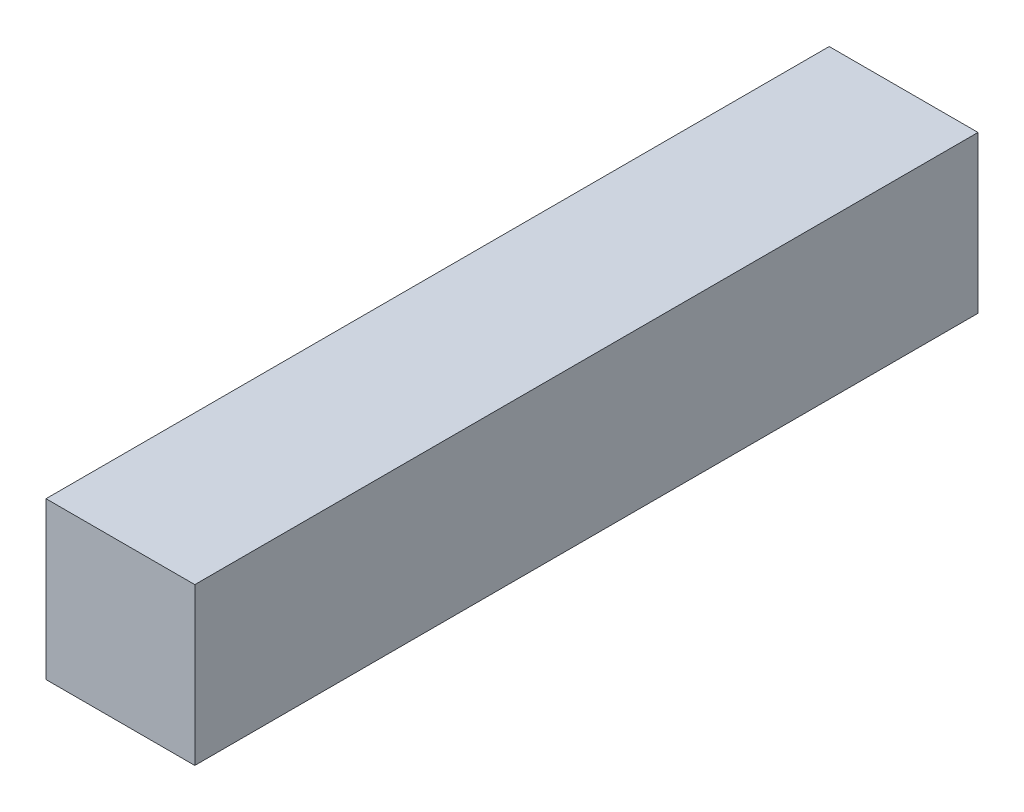
ISO-10303-21;
HEADER;
FILE_DESCRIPTION(('STEP AP214'),'2;1');
FILE_NAME('part.step','',(''),(''),'','','');
FILE_SCHEMA(('AUTOMOTIVE_DESIGN { 1 0 10303 214 1 1 1 1 }'));
ENDSEC;
DATA;
#1=APPLICATION_CONTEXT('core data for automotive mechanical design processes');
#2=APPLICATION_PROTOCOL_DEFINITION('international standard','automotive_design',2000,#1);
#3=PRODUCT_CONTEXT('',#1,'mechanical');
#4=PRODUCT('Part','Part','',(#3));
#5=PRODUCT_RELATED_PRODUCT_CATEGORY('part','',(#4));
#6=PRODUCT_DEFINITION_FORMATION('','',#4);
#7=PRODUCT_DEFINITION_CONTEXT('part definition',#1,'design');
#8=PRODUCT_DEFINITION('design','',#6,#7);
#9=PRODUCT_DEFINITION_SHAPE('','',#8);
#10=(LENGTH_UNIT() NAMED_UNIT(*) SI_UNIT(.MILLI.,.METRE.));
#11=(NAMED_UNIT(*) PLANE_ANGLE_UNIT() SI_UNIT($,.RADIAN.));
#12=(NAMED_UNIT(*) SI_UNIT($,.STERADIAN.) SOLID_ANGLE_UNIT());
#13=UNCERTAINTY_MEASURE_WITH_UNIT(LENGTH_MEASURE(1.E-05),#10,'distance_accuracy_value','');
#14=(GEOMETRIC_REPRESENTATION_CONTEXT(3) GLOBAL_UNCERTAINTY_ASSIGNED_CONTEXT((#13)) GLOBAL_UNIT_ASSIGNED_CONTEXT((#10,
#11,#12)) REPRESENTATION_CONTEXT('',''));
#15=CARTESIAN_POINT('',(0.,0.,0.));
#16=DIRECTION('',(0.,0.,1.));
#17=DIRECTION('',(1.,0.,0.));
#18=AXIS2_PLACEMENT_3D('',#15,#16,#17);
#19=CARTESIAN_POINT('',(0.95,1.,10.));
#20=DIRECTION('',(-1.,0.,0.));
#21=DIRECTION('',(0.,-1.,0.));
#22=AXIS2_PLACEMENT_3D('',#19,#20,#21);
#23=PLANE('',#22);
#24=DIRECTION('',(0.,1.,0.));
#25=VECTOR('',#24,1.);
#26=CARTESIAN_POINT('',(0.95,1.,0.));
#27=LINE('',#26,#25);
#28=CARTESIAN_POINT('',(0.95,-1.,0.));
#29=VERTEX_POINT('',#28);
#30=CARTESIAN_POINT('',(0.95,1.,0.));
#31=VERTEX_POINT('',#30);
#32=EDGE_CURVE('E102',#29,#31,#27,.T.);
#33=ORIENTED_EDGE('',*,*,#32,.T.);
#34=DIRECTION('',(0.,0.,-1.));
#35=VECTOR('',#34,1.);
#36=CARTESIAN_POINT('',(0.95,1.,10.));
#37=LINE('',#36,#35);
#38=CARTESIAN_POINT('',(0.95,1.,10.));
#39=VERTEX_POINT('',#38);
#40=EDGE_CURVE('E11',#39,#31,#37,.T.);
#41=ORIENTED_EDGE('',*,*,#40,.F.);
#42=DIRECTION('',(0.,1.,0.));
#43=VECTOR('',#42,1.);
#44=CARTESIAN_POINT('',(0.95,1.,10.));
#45=LINE('',#44,#43);
#46=CARTESIAN_POINT('',(0.95,-1.,10.));
#47=VERTEX_POINT('',#46);
#48=EDGE_CURVE('E90',#47,#39,#45,.T.);
#49=ORIENTED_EDGE('',*,*,#48,.F.);
#50=DIRECTION('',(0.,0.,-1.));
#51=VECTOR('',#50,1.);
#52=CARTESIAN_POINT('',(0.95,-1.,10.));
#53=LINE('',#52,#51);
#54=EDGE_CURVE('E98',#47,#29,#53,.T.);
#55=ORIENTED_EDGE('',*,*,#54,.T.);
#56=EDGE_LOOP('',(#33,#41,#49,#55));
#57=FACE_BOUND('',#56,.T.);
#58=ADVANCED_FACE('F39',(#57),#23,.F.);
#59=CARTESIAN_POINT('',(-0.95,1.,10.));
#60=DIRECTION('',(0.,-1.,0.));
#61=DIRECTION('',(0.,0.,-1.));
#62=AXIS2_PLACEMENT_3D('',#59,#60,#61);
#63=PLANE('',#62);
#64=DIRECTION('',(-1.,0.,0.));
#65=VECTOR('',#64,1.);
#66=CARTESIAN_POINT('',(-0.95,1.,0.));
#67=LINE('',#66,#65);
#68=CARTESIAN_POINT('',(-0.95,1.,0.));
#69=VERTEX_POINT('',#68);
#70=EDGE_CURVE('E94',#31,#69,#67,.T.);
#71=ORIENTED_EDGE('',*,*,#70,.T.);
#72=DIRECTION('',(0.,0.,-1.));
#73=VECTOR('',#72,1.);
#74=CARTESIAN_POINT('',(-0.95,1.,10.));
#75=LINE('',#74,#73);
#76=CARTESIAN_POINT('',(-0.95,1.,10.));
#77=VERTEX_POINT('',#76);
#78=EDGE_CURVE('E47',#77,#69,#75,.T.);
#79=ORIENTED_EDGE('',*,*,#78,.F.);
#80=DIRECTION('',(-1.,0.,0.));
#81=VECTOR('',#80,1.);
#82=CARTESIAN_POINT('',(-0.95,1.,10.));
#83=LINE('',#82,#81);
#84=EDGE_CURVE('E85',#39,#77,#83,.T.);
#85=ORIENTED_EDGE('',*,*,#84,.F.);
#86=ORIENTED_EDGE('',*,*,#40,.T.);
#87=EDGE_LOOP('',(#71,#79,#85,#86));
#88=FACE_BOUND('',#87,.T.);
#89=ADVANCED_FACE('F93',(#88),#63,.F.);
#90=CARTESIAN_POINT('',(-0.95,1.,10.));
#91=DIRECTION('',(1.,0.,0.));
#92=DIRECTION('',(0.,1.,0.));
#93=AXIS2_PLACEMENT_3D('',#90,#91,#92);
#94=PLANE('',#93);
#95=DIRECTION('',(0.,-1.,0.));
#96=VECTOR('',#95,1.);
#97=CARTESIAN_POINT('',(-0.95,1.,0.));
#98=LINE('',#97,#96);
#99=CARTESIAN_POINT('',(-0.95,-1.,0.));
#100=VERTEX_POINT('',#99);
#101=EDGE_CURVE('E72',#69,#100,#98,.T.);
#102=ORIENTED_EDGE('',*,*,#101,.T.);
#103=DIRECTION('',(0.,0.,-1.));
#104=VECTOR('',#103,1.);
#105=CARTESIAN_POINT('',(-0.95,-1.,10.));
#106=LINE('',#105,#104);
#107=CARTESIAN_POINT('',(-0.95,-1.,10.));
#108=VERTEX_POINT('',#107);
#109=EDGE_CURVE('E95',#108,#100,#106,.T.);
#110=ORIENTED_EDGE('',*,*,#109,.F.);
#111=DIRECTION('',(0.,-1.,0.));
#112=VECTOR('',#111,1.);
#113=CARTESIAN_POINT('',(-0.95,1.,10.));
#114=LINE('',#113,#112);
#115=EDGE_CURVE('E88',#77,#108,#114,.T.);
#116=ORIENTED_EDGE('',*,*,#115,.F.);
#117=ORIENTED_EDGE('',*,*,#78,.T.);
#118=EDGE_LOOP('',(#102,#110,#116,#117));
#119=FACE_BOUND('',#118,.T.);
#120=ADVANCED_FACE('F96',(#119),#94,.F.);
#121=CARTESIAN_POINT('',(-0.95,-1.,10.));
#122=DIRECTION('',(0.,1.,0.));
#123=DIRECTION('',(0.,0.,1.));
#124=AXIS2_PLACEMENT_3D('',#121,#122,#123);
#125=PLANE('',#124);
#126=DIRECTION('',(1.,0.,0.));
#127=VECTOR('',#126,1.);
#128=CARTESIAN_POINT('',(-0.95,-1.,0.));
#129=LINE('',#128,#127);
#130=EDGE_CURVE('E78',#100,#29,#129,.T.);
#131=ORIENTED_EDGE('',*,*,#130,.T.);
#132=ORIENTED_EDGE('',*,*,#54,.F.);
#133=DIRECTION('',(1.,0.,0.));
#134=VECTOR('',#133,1.);
#135=CARTESIAN_POINT('',(-0.95,-1.,10.));
#136=LINE('',#135,#134);
#137=EDGE_CURVE('E55',#108,#47,#136,.T.);
#138=ORIENTED_EDGE('',*,*,#137,.F.);
#139=ORIENTED_EDGE('',*,*,#109,.T.);
#140=EDGE_LOOP('',(#131,#132,#138,#139));
#141=FACE_BOUND('',#140,.T.);
#142=ADVANCED_FACE('F109',(#141),#125,.F.);
#143=CARTESIAN_POINT('',(0.,0.,10.));
#144=DIRECTION('',(0.,0.,1.));
#145=DIRECTION('',(1.,0.,0.));
#146=AXIS2_PLACEMENT_3D('',#143,#144,#145);
#147=PLANE('',#146);
#148=ORIENTED_EDGE('',*,*,#48,.T.);
#149=ORIENTED_EDGE('',*,*,#84,.T.);
#150=ORIENTED_EDGE('',*,*,#115,.T.);
#151=ORIENTED_EDGE('',*,*,#137,.T.);
#152=EDGE_LOOP('',(#148,#149,#150,#151));
#153=FACE_BOUND('',#152,.T.);
#154=ADVANCED_FACE('F86',(#153),#147,.T.);
#155=CARTESIAN_POINT('',(0.,0.,0.));
#156=DIRECTION('',(0.,0.,1.));
#157=DIRECTION('',(1.,0.,0.));
#158=AXIS2_PLACEMENT_3D('',#155,#156,#157);
#159=PLANE('',#158);
#160=ORIENTED_EDGE('',*,*,#32,.F.);
#161=ORIENTED_EDGE('',*,*,#130,.F.);
#162=ORIENTED_EDGE('',*,*,#101,.F.);
#163=ORIENTED_EDGE('',*,*,#70,.F.);
#164=EDGE_LOOP('',(#160,#161,#162,#163));
#165=FACE_BOUND('',#164,.T.);
#166=ADVANCED_FACE('F112',(#165),#159,.F.);
#167=CLOSED_SHELL('',(#58,#89,#120,#142,#154,#166));
#168=MANIFOLD_SOLID_BREP('B2',#167);
#169=ADVANCED_BREP_SHAPE_REPRESENTATION('',(#18,#168),#14);
#170=SHAPE_DEFINITION_REPRESENTATION(#9,#169);
ENDSEC;
END-ISO-10303-21;
